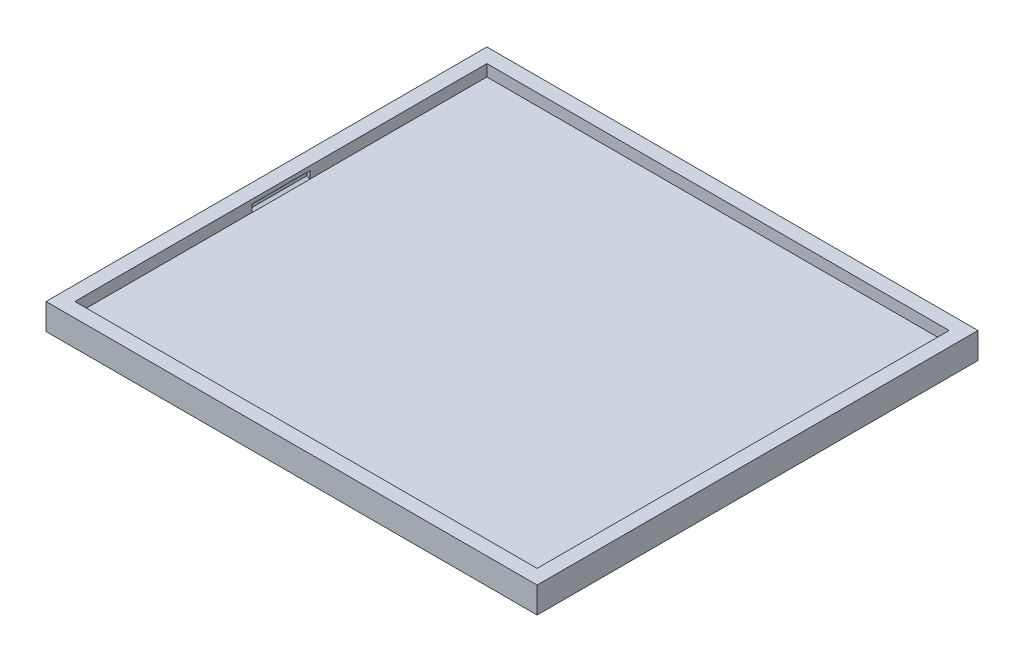
ISO-10303-21;
HEADER;
FILE_DESCRIPTION(('STEP AP214'),'2;1');
FILE_NAME('part.step','',(''),(''),'','','');
FILE_SCHEMA(('AUTOMOTIVE_DESIGN { 1 0 10303 214 1 1 1 1 }'));
ENDSEC;
DATA;
#1=APPLICATION_CONTEXT('core data for automotive mechanical design processes');
#2=APPLICATION_PROTOCOL_DEFINITION('international standard','automotive_design',2000,#1);
#3=PRODUCT_CONTEXT('',#1,'mechanical');
#4=PRODUCT('Part','Part','',(#3));
#5=PRODUCT_RELATED_PRODUCT_CATEGORY('part','',(#4));
#6=PRODUCT_DEFINITION_FORMATION('','',#4);
#7=PRODUCT_DEFINITION_CONTEXT('part definition',#1,'design');
#8=PRODUCT_DEFINITION('design','',#6,#7);
#9=PRODUCT_DEFINITION_SHAPE('','',#8);
#10=(LENGTH_UNIT() NAMED_UNIT(*) SI_UNIT(.MILLI.,.METRE.));
#11=(NAMED_UNIT(*) PLANE_ANGLE_UNIT() SI_UNIT($,.RADIAN.));
#12=(NAMED_UNIT(*) SI_UNIT($,.STERADIAN.) SOLID_ANGLE_UNIT());
#13=UNCERTAINTY_MEASURE_WITH_UNIT(LENGTH_MEASURE(1.E-05),#10,'distance_accuracy_value','');
#14=(GEOMETRIC_REPRESENTATION_CONTEXT(3) GLOBAL_UNCERTAINTY_ASSIGNED_CONTEXT((#13)) GLOBAL_UNIT_ASSIGNED_CONTEXT((#10,
#11,#12)) REPRESENTATION_CONTEXT('',''));
#15=CARTESIAN_POINT('',(0.,0.,0.));
#16=DIRECTION('',(0.,0.,1.));
#17=DIRECTION('',(1.,0.,0.));
#18=AXIS2_PLACEMENT_3D('',#15,#16,#17);
#19=CARTESIAN_POINT('',(-0.05,12.7,0.05));
#20=DIRECTION('',(1.,0.,0.));
#21=DIRECTION('',(0.,0.,-1.));
#22=AXIS2_PLACEMENT_3D('',#19,#20,#21);
#23=PLANE('',#22);
#24=DIRECTION('',(0.,0.,1.));
#25=VECTOR('',#24,1.);
#26=CARTESIAN_POINT('',(-0.05,9.5957106781186,0.0499999999999992));
#27=LINE('',#26,#25);
#28=CARTESIAN_POINT('',(-0.05,9.59571067811863,-103.251));
#29=VERTEX_POINT('',#28);
#30=CARTESIAN_POINT('',(-0.05,9.59571067811862,-77.851));
#31=VERTEX_POINT('',#30);
#32=EDGE_CURVE('E11',#29,#31,#27,.T.);
#33=ORIENTED_EDGE('',*,*,#32,.F.);
#34=DIRECTION('',(0.,-1.,0.));
#35=VECTOR('',#34,1.);
#36=CARTESIAN_POINT('',(-0.05,12.7,-103.251));
#37=LINE('',#36,#35);
#38=CARTESIAN_POINT('',(-0.05,6.35,-103.251));
#39=VERTEX_POINT('',#38);
#40=EDGE_CURVE('E245',#29,#39,#37,.T.);
#41=ORIENTED_EDGE('',*,*,#40,.T.);
#42=DIRECTION('',(0.,0.,-1.));
#43=VECTOR('',#42,1.);
#44=CARTESIAN_POINT('',(-0.05,6.35,0.));
#45=LINE('',#44,#43);
#46=CARTESIAN_POINT('',(-0.05,6.35,-181.152));
#47=VERTEX_POINT('',#46);
#48=EDGE_CURVE('E320',#39,#47,#45,.T.);
#49=ORIENTED_EDGE('',*,*,#48,.T.);
#50=DIRECTION('',(0.,-1.,0.));
#51=VECTOR('',#50,1.);
#52=CARTESIAN_POINT('',(-0.05,12.7,-181.152));
#53=LINE('',#52,#51);
#54=CARTESIAN_POINT('',(-0.05,11.43,-181.152));
#55=VERTEX_POINT('',#54);
#56=EDGE_CURVE('E331',#55,#47,#53,.T.);
#57=ORIENTED_EDGE('',*,*,#56,.F.);
#58=DIRECTION('',(0.,0.,1.));
#59=VECTOR('',#58,1.);
#60=CARTESIAN_POINT('',(-0.05,11.43,-181.152));
#61=LINE('',#60,#59);
#62=CARTESIAN_POINT('',(-0.05,11.43,0.05));
#63=VERTEX_POINT('',#62);
#64=EDGE_CURVE('E249',#55,#63,#61,.T.);
#65=ORIENTED_EDGE('',*,*,#64,.T.);
#66=DIRECTION('',(0.,-1.,0.));
#67=VECTOR('',#66,1.);
#68=CARTESIAN_POINT('',(-0.05,12.7,0.05));
#69=LINE('',#68,#67);
#70=CARTESIAN_POINT('',(-0.05,6.35,0.05));
#71=VERTEX_POINT('',#70);
#72=EDGE_CURVE('E343',#63,#71,#69,.T.);
#73=ORIENTED_EDGE('',*,*,#72,.T.);
#74=CARTESIAN_POINT('',(-0.05,6.35,-77.851));
#75=VERTEX_POINT('',#74);
#76=EDGE_CURVE('E319',#71,#75,#45,.T.);
#77=ORIENTED_EDGE('',*,*,#76,.T.);
#78=DIRECTION('',(0.,-1.,0.));
#79=VECTOR('',#78,1.);
#80=CARTESIAN_POINT('',(-0.05,12.7,-77.851));
#81=LINE('',#80,#79);
#82=EDGE_CURVE('E66',#31,#75,#81,.T.);
#83=ORIENTED_EDGE('',*,*,#82,.F.);
#84=EDGE_LOOP('',(#33,#41,#49,#57,#65,#73,#77,#83));
#85=FACE_BOUND('',#84,.T.);
#86=ADVANCED_FACE('F55',(#85),#23,.T.);
#87=CARTESIAN_POINT('',(0.,6.35,0.));
#88=DIRECTION('',(0.,1.,0.));
#89=DIRECTION('',(0.,0.,1.));
#90=AXIS2_PLACEMENT_3D('',#87,#88,#89);
#91=PLANE('',#90);
#92=ORIENTED_EDGE('',*,*,#48,.F.);
#93=DIRECTION('',(1.,0.,0.));
#94=VECTOR('',#93,1.);
#95=CARTESIAN_POINT('',(0.,6.35,-103.251));
#96=LINE('',#95,#94);
#97=CARTESIAN_POINT('',(0.,6.35,-103.251));
#98=VERTEX_POINT('',#97);
#99=EDGE_CURVE('E62',#39,#98,#96,.T.);
#100=ORIENTED_EDGE('',*,*,#99,.T.);
#101=DIRECTION('',(0.,0.,-1.));
#102=VECTOR('',#101,1.);
#103=CARTESIAN_POINT('',(0.,6.35,0.));
#104=LINE('',#103,#102);
#105=CARTESIAN_POINT('',(0.,6.35,-77.851));
#106=VERTEX_POINT('',#105);
#107=EDGE_CURVE('E391',#106,#98,#104,.T.);
#108=ORIENTED_EDGE('',*,*,#107,.F.);
#109=DIRECTION('',(1.,0.,0.));
#110=VECTOR('',#109,1.);
#111=CARTESIAN_POINT('',(0.,6.35,-77.851));
#112=LINE('',#111,#110);
#113=EDGE_CURVE('E215',#75,#106,#112,.T.);
#114=ORIENTED_EDGE('',*,*,#113,.F.);
#115=ORIENTED_EDGE('',*,*,#76,.F.);
#116=DIRECTION('',(1.,0.,0.));
#117=VECTOR('',#116,1.);
#118=CARTESIAN_POINT('',(0.,6.35,0.05));
#119=LINE('',#118,#117);
#120=CARTESIAN_POINT('',(203.25,6.35,0.05));
#121=VERTEX_POINT('',#120);
#122=EDGE_CURVE('E324',#71,#121,#119,.T.);
#123=ORIENTED_EDGE('',*,*,#122,.T.);
#124=DIRECTION('',(0.,0.,-1.));
#125=VECTOR('',#124,1.);
#126=CARTESIAN_POINT('',(203.25,6.35,0.));
#127=LINE('',#126,#125);
#128=CARTESIAN_POINT('',(203.25,6.35,-77.851));
#129=VERTEX_POINT('',#128);
#130=EDGE_CURVE('E330',#121,#129,#127,.T.);
#131=ORIENTED_EDGE('',*,*,#130,.T.);
#132=DIRECTION('',(1.,0.,0.));
#133=VECTOR('',#132,1.);
#134=CARTESIAN_POINT('',(0.,6.35,-77.851));
#135=LINE('',#134,#133);
#136=CARTESIAN_POINT('',(203.2,6.35,-77.851));
#137=VERTEX_POINT('',#136);
#138=EDGE_CURVE('E376',#137,#129,#135,.T.);
#139=ORIENTED_EDGE('',*,*,#138,.F.);
#140=DIRECTION('',(0.,0.,-1.));
#141=VECTOR('',#140,1.);
#142=CARTESIAN_POINT('',(203.2,6.35,0.));
#143=LINE('',#142,#141);
#144=CARTESIAN_POINT('',(203.2,6.35,-103.251));
#145=VERTEX_POINT('',#144);
#146=EDGE_CURVE('E378',#137,#145,#143,.T.);
#147=ORIENTED_EDGE('',*,*,#146,.T.);
#148=DIRECTION('',(1.,0.,0.));
#149=VECTOR('',#148,1.);
#150=CARTESIAN_POINT('',(0.,6.35,-103.251));
#151=LINE('',#150,#149);
#152=CARTESIAN_POINT('',(203.25,6.35,-103.251));
#153=VERTEX_POINT('',#152);
#154=EDGE_CURVE('E384',#145,#153,#151,.T.);
#155=ORIENTED_EDGE('',*,*,#154,.T.);
#156=CARTESIAN_POINT('',(203.25,6.35,-181.152));
#157=VERTEX_POINT('',#156);
#158=EDGE_CURVE('E328',#153,#157,#127,.T.);
#159=ORIENTED_EDGE('',*,*,#158,.T.);
#160=DIRECTION('',(1.,0.,0.));
#161=VECTOR('',#160,1.);
#162=CARTESIAN_POINT('',(0.,6.35,-181.152));
#163=LINE('',#162,#161);
#164=EDGE_CURVE('E333',#47,#157,#163,.T.);
#165=ORIENTED_EDGE('',*,*,#164,.F.);
#166=EDGE_LOOP('',(#92,#100,#108,#114,#115,#123,#131,#139,#147,#155,#159,#165));
#167=FACE_BOUND('',#166,.T.);
#168=ADVANCED_FACE('F400',(#167),#91,.T.);
#169=CARTESIAN_POINT('',(203.25,12.7,0.05));
#170=DIRECTION('',(-1.,0.,0.));
#171=DIRECTION('',(0.,0.,1.));
#172=AXIS2_PLACEMENT_3D('',#169,#170,#171);
#173=PLANE('',#172);
#174=DIRECTION('',(0.,-1.,0.));
#175=VECTOR('',#174,1.);
#176=CARTESIAN_POINT('',(203.25,12.7,0.05));
#177=LINE('',#176,#175);
#178=CARTESIAN_POINT('',(203.25,11.43,0.05));
#179=VERTEX_POINT('',#178);
#180=EDGE_CURVE('E344',#179,#121,#177,.T.);
#181=ORIENTED_EDGE('',*,*,#180,.F.);
#182=DIRECTION('',(0.,0.,-1.));
#183=VECTOR('',#182,1.);
#184=CARTESIAN_POINT('',(203.25,11.43,0.05));
#185=LINE('',#184,#183);
#186=CARTESIAN_POINT('',(203.25,11.43,-181.152));
#187=VERTEX_POINT('',#186);
#188=EDGE_CURVE('E260',#179,#187,#185,.T.);
#189=ORIENTED_EDGE('',*,*,#188,.T.);
#190=DIRECTION('',(0.,-1.,0.));
#191=VECTOR('',#190,1.);
#192=CARTESIAN_POINT('',(203.25,12.7,-181.152));
#193=LINE('',#192,#191);
#194=EDGE_CURVE('E339',#187,#157,#193,.T.);
#195=ORIENTED_EDGE('',*,*,#194,.T.);
#196=ORIENTED_EDGE('',*,*,#158,.F.);
#197=DIRECTION('',(0.,1.,0.));
#198=VECTOR('',#197,1.);
#199=CARTESIAN_POINT('',(203.25,12.7,-103.251));
#200=LINE('',#199,#198);
#201=CARTESIAN_POINT('',(203.25,9.59571067811865,-103.251));
#202=VERTEX_POINT('',#201);
#203=EDGE_CURVE('E312',#153,#202,#200,.T.);
#204=ORIENTED_EDGE('',*,*,#203,.T.);
#205=DIRECTION('',(0.,0.,1.));
#206=VECTOR('',#205,1.);
#207=CARTESIAN_POINT('',(203.25,9.59571067811865,0.05));
#208=LINE('',#207,#206);
#209=CARTESIAN_POINT('',(203.25,9.59571067811865,-77.851));
#210=VERTEX_POINT('',#209);
#211=EDGE_CURVE('E389',#202,#210,#208,.T.);
#212=ORIENTED_EDGE('',*,*,#211,.T.);
#213=DIRECTION('',(0.,1.,0.));
#214=VECTOR('',#213,1.);
#215=CARTESIAN_POINT('',(203.25,12.7,-77.851));
#216=LINE('',#215,#214);
#217=EDGE_CURVE('E309',#129,#210,#216,.T.);
#218=ORIENTED_EDGE('',*,*,#217,.F.);
#219=ORIENTED_EDGE('',*,*,#130,.F.);
#220=EDGE_LOOP('',(#181,#189,#195,#196,#204,#212,#218,#219));
#221=FACE_BOUND('',#220,.T.);
#222=ADVANCED_FACE('F430',(#221),#173,.T.);
#223=CARTESIAN_POINT('',(-0.05,12.7,-181.152));
#224=DIRECTION('',(0.,0.,1.));
#225=DIRECTION('',(1.,0.,0.));
#226=AXIS2_PLACEMENT_3D('',#223,#224,#225);
#227=PLANE('',#226);
#228=ORIENTED_EDGE('',*,*,#194,.F.);
#229=DIRECTION('',(-1.,0.,0.));
#230=VECTOR('',#229,1.);
#231=CARTESIAN_POINT('',(203.25,11.43,-181.152));
#232=LINE('',#231,#230);
#233=EDGE_CURVE('E246',#187,#55,#232,.T.);
#234=ORIENTED_EDGE('',*,*,#233,.T.);
#235=ORIENTED_EDGE('',*,*,#56,.T.);
#236=ORIENTED_EDGE('',*,*,#164,.T.);
#237=EDGE_LOOP('',(#228,#234,#235,#236));
#238=FACE_BOUND('',#237,.T.);
#239=ADVANCED_FACE('F494',(#238),#227,.T.);
#240=CARTESIAN_POINT('',(-0.05,12.7,0.05));
#241=DIRECTION('',(0.,0.,-1.));
#242=DIRECTION('',(-1.,0.,0.));
#243=AXIS2_PLACEMENT_3D('',#240,#241,#242);
#244=PLANE('',#243);
#245=ORIENTED_EDGE('',*,*,#72,.F.);
#246=DIRECTION('',(1.,0.,0.));
#247=VECTOR('',#246,1.);
#248=CARTESIAN_POINT('',(-0.05,11.43,0.05));
#249=LINE('',#248,#247);
#250=EDGE_CURVE('E251',#63,#179,#249,.T.);
#251=ORIENTED_EDGE('',*,*,#250,.T.);
#252=ORIENTED_EDGE('',*,*,#180,.T.);
#253=ORIENTED_EDGE('',*,*,#122,.F.);
#254=EDGE_LOOP('',(#245,#251,#252,#253));
#255=FACE_BOUND('',#254,.T.);
#256=ADVANCED_FACE('F431',(#255),#244,.T.);
#257=CARTESIAN_POINT('',(203.2,6.26339745962156,-103.251));
#258=DIRECTION('',(1.,0.,0.));
#259=DIRECTION('',(0.,0.,-1.));
#260=AXIS2_PLACEMENT_3D('',#257,#258,#259);
#261=PLANE('',#260);
#262=DIRECTION('',(0.,1.,0.));
#263=VECTOR('',#262,1.);
#264=CARTESIAN_POINT('',(203.2,6.26339745962156,-77.851));
#265=LINE('',#264,#263);
#266=CARTESIAN_POINT('',(203.2,6.26339745962156,-77.851));
#267=VERTEX_POINT('',#266);
#268=EDGE_CURVE('E275',#267,#137,#265,.T.);
#269=ORIENTED_EDGE('',*,*,#268,.F.);
#270=DIRECTION('',(0.,0.,1.));
#271=VECTOR('',#270,1.);
#272=CARTESIAN_POINT('',(203.2,6.26339745962156,-103.251));
#273=LINE('',#272,#271);
#274=CARTESIAN_POINT('',(203.2,6.26339745962156,-103.251));
#275=VERTEX_POINT('',#274);
#276=EDGE_CURVE('E297',#275,#267,#273,.T.);
#277=ORIENTED_EDGE('',*,*,#276,.F.);
#278=DIRECTION('',(0.,1.,0.));
#279=VECTOR('',#278,1.);
#280=CARTESIAN_POINT('',(203.2,6.26339745962156,-103.251));
#281=LINE('',#280,#279);
#282=EDGE_CURVE('E288',#275,#145,#281,.T.);
#283=ORIENTED_EDGE('',*,*,#282,.T.);
#284=ORIENTED_EDGE('',*,*,#146,.F.);
#285=EDGE_LOOP('',(#269,#277,#283,#284));
#286=FACE_BOUND('',#285,.T.);
#287=ADVANCED_FACE('F490',(#286),#261,.T.);
#288=CARTESIAN_POINT('',(203.2,9.64571067811865,-103.251));
#289=DIRECTION('',(-0.707106781186544,-0.707106781186551,0.));
#290=DIRECTION('',(0.707106781186551,-0.707106781186544,0.));
#291=AXIS2_PLACEMENT_3D('',#288,#289,#290);
#292=PLANE('',#291);
#293=DIRECTION('',(0.707106781186551,-0.707106781186544,0.));
#294=VECTOR('',#293,1.);
#295=CARTESIAN_POINT('',(203.2,9.64571067811865,-103.251));
#296=LINE('',#295,#294);
#297=CARTESIAN_POINT('',(204.507721605791,8.33798907232798,-103.251));
#298=VERTEX_POINT('',#297);
#299=EDGE_CURVE('E286',#202,#298,#296,.T.);
#300=ORIENTED_EDGE('',*,*,#299,.T.);
#301=DIRECTION('',(0.,0.,1.));
#302=VECTOR('',#301,1.);
#303=CARTESIAN_POINT('',(204.507721605791,8.33798907232798,-103.251));
#304=LINE('',#303,#302);
#305=CARTESIAN_POINT('',(204.507721605791,8.33798907232798,-77.851));
#306=VERTEX_POINT('',#305);
#307=EDGE_CURVE('E306',#298,#306,#304,.T.);
#308=ORIENTED_EDGE('',*,*,#307,.T.);
#309=DIRECTION('',(0.707106781186551,-0.707106781186544,0.));
#310=VECTOR('',#309,1.);
#311=CARTESIAN_POINT('',(203.2,9.64571067811865,-77.851));
#312=LINE('',#311,#310);
#313=EDGE_CURVE('E273',#210,#306,#312,.T.);
#314=ORIENTED_EDGE('',*,*,#313,.F.);
#315=ORIENTED_EDGE('',*,*,#211,.F.);
#316=EDGE_LOOP('',(#300,#308,#314,#315));
#317=FACE_BOUND('',#316,.T.);
#318=ADVANCED_FACE('F481',(#317),#292,.T.);
#319=CARTESIAN_POINT('',(204.507721605791,7.0184108807499,-103.251));
#320=DIRECTION('',(1.,0.,0.));
#321=DIRECTION('',(0.,0.,-1.));
#322=AXIS2_PLACEMENT_3D('',#319,#320,#321);
#323=PLANE('',#322);
#324=ORIENTED_EDGE('',*,*,#307,.F.);
#325=DIRECTION('',(0.,1.,0.));
#326=VECTOR('',#325,1.);
#327=CARTESIAN_POINT('',(204.507721605791,7.0184108807499,-103.251));
#328=LINE('',#327,#326);
#329=CARTESIAN_POINT('',(204.507721605791,7.0184108807499,-103.251));
#330=VERTEX_POINT('',#329);
#331=EDGE_CURVE('E291',#330,#298,#328,.T.);
#332=ORIENTED_EDGE('',*,*,#331,.F.);
#333=DIRECTION('',(0.,0.,1.));
#334=VECTOR('',#333,1.);
#335=CARTESIAN_POINT('',(204.507721605791,7.0184108807499,-103.251));
#336=LINE('',#335,#334);
#337=CARTESIAN_POINT('',(204.507721605791,7.0184108807499,-77.851));
#338=VERTEX_POINT('',#337);
#339=EDGE_CURVE('E303',#330,#338,#336,.T.);
#340=ORIENTED_EDGE('',*,*,#339,.T.);
#341=DIRECTION('',(0.,1.,0.));
#342=VECTOR('',#341,1.);
#343=CARTESIAN_POINT('',(204.507721605791,7.0184108807499,-77.851));
#344=LINE('',#343,#342);
#345=EDGE_CURVE('E280',#338,#306,#344,.T.);
#346=ORIENTED_EDGE('',*,*,#345,.T.);
#347=EDGE_LOOP('',(#324,#332,#340,#346));
#348=FACE_BOUND('',#347,.T.);
#349=ADVANCED_FACE('F483',(#348),#323,.F.);
#350=CARTESIAN_POINT('',(204.507721605791,7.0184108807499,-103.251));
#351=DIRECTION('',(-0.500000000000001,0.866025403784438,0.));
#352=DIRECTION('',(-0.866025403784438,-0.500000000000001,0.));
#353=AXIS2_PLACEMENT_3D('',#350,#351,#352);
#354=PLANE('',#353);
#355=ORIENTED_EDGE('',*,*,#339,.F.);
#356=DIRECTION('',(-0.866025403784438,-0.500000000000001,0.));
#357=VECTOR('',#356,1.);
#358=CARTESIAN_POINT('',(204.507721605791,7.0184108807499,-103.251));
#359=LINE('',#358,#357);
#360=EDGE_CURVE('E300',#330,#275,#359,.T.);
#361=ORIENTED_EDGE('',*,*,#360,.T.);
#362=ORIENTED_EDGE('',*,*,#276,.T.);
#363=DIRECTION('',(-0.866025403784438,-0.500000000000001,0.));
#364=VECTOR('',#363,1.);
#365=CARTESIAN_POINT('',(204.507721605791,7.0184108807499,-77.851));
#366=LINE('',#365,#364);
#367=EDGE_CURVE('E285',#338,#267,#366,.T.);
#368=ORIENTED_EDGE('',*,*,#367,.F.);
#369=EDGE_LOOP('',(#355,#361,#362,#368));
#370=FACE_BOUND('',#369,.T.);
#371=ADVANCED_FACE('F480',(#370),#354,.T.);
#372=CARTESIAN_POINT('',(0.,0.,-103.251));
#373=DIRECTION('',(0.,0.,1.));
#374=DIRECTION('',(1.,0.,0.));
#375=AXIS2_PLACEMENT_3D('',#372,#373,#374);
#376=PLANE('',#375);
#377=ORIENTED_EDGE('',*,*,#154,.F.);
#378=ORIENTED_EDGE('',*,*,#282,.F.);
#379=ORIENTED_EDGE('',*,*,#360,.F.);
#380=ORIENTED_EDGE('',*,*,#331,.T.);
#381=ORIENTED_EDGE('',*,*,#299,.F.);
#382=ORIENTED_EDGE('',*,*,#203,.F.);
#383=EDGE_LOOP('',(#377,#378,#379,#380,#381,#382));
#384=FACE_BOUND('',#383,.T.);
#385=ADVANCED_FACE('F468',(#384),#376,.T.);
#386=CARTESIAN_POINT('',(0.,0.,-77.851));
#387=DIRECTION('',(0.,0.,1.));
#388=DIRECTION('',(1.,0.,0.));
#389=AXIS2_PLACEMENT_3D('',#386,#387,#388);
#390=PLANE('',#389);
#391=ORIENTED_EDGE('',*,*,#217,.T.);
#392=ORIENTED_EDGE('',*,*,#313,.T.);
#393=ORIENTED_EDGE('',*,*,#345,.F.);
#394=ORIENTED_EDGE('',*,*,#367,.T.);
#395=ORIENTED_EDGE('',*,*,#268,.T.);
#396=ORIENTED_EDGE('',*,*,#138,.T.);
#397=EDGE_LOOP('',(#391,#392,#393,#394,#395,#396));
#398=FACE_BOUND('',#397,.T.);
#399=ADVANCED_FACE('F464',(#398),#390,.F.);
#400=CARTESIAN_POINT('',(0.,11.43,0.));
#401=DIRECTION('',(0.,1.,0.));
#402=DIRECTION('',(0.,0.,1.));
#403=AXIS2_PLACEMENT_3D('',#400,#401,#402);
#404=PLANE('',#403);
#405=ORIENTED_EDGE('',*,*,#188,.F.);
#406=ORIENTED_EDGE('',*,*,#250,.F.);
#407=ORIENTED_EDGE('',*,*,#64,.F.);
#408=ORIENTED_EDGE('',*,*,#233,.F.);
#409=EDGE_LOOP('',(#405,#406,#407,#408));
#410=FACE_BOUND('',#409,.T.);
#411=DIRECTION('',(-1.,0.,0.));
#412=VECTOR('',#411,1.);
#413=CARTESIAN_POINT('',(209.6,11.43,-187.502));
#414=LINE('',#413,#412);
#415=CARTESIAN_POINT('',(209.6,11.43,-187.502));
#416=VERTEX_POINT('',#415);
#417=CARTESIAN_POINT('',(-6.4,11.43,-187.502));
#418=VERTEX_POINT('',#417);
#419=EDGE_CURVE('E263',#416,#418,#414,.T.);
#420=ORIENTED_EDGE('',*,*,#419,.T.);
#421=DIRECTION('',(0.,0.,1.));
#422=VECTOR('',#421,1.);
#423=CARTESIAN_POINT('',(-6.4,11.43,-187.502));
#424=LINE('',#423,#422);
#425=CARTESIAN_POINT('',(-6.39999999999998,11.43,6.4));
#426=VERTEX_POINT('',#425);
#427=EDGE_CURVE('E262',#418,#426,#424,.T.);
#428=ORIENTED_EDGE('',*,*,#427,.T.);
#429=DIRECTION('',(1.,0.,0.));
#430=VECTOR('',#429,1.);
#431=CARTESIAN_POINT('',(-6.39999999999998,11.43,6.4));
#432=LINE('',#431,#430);
#433=CARTESIAN_POINT('',(209.6,11.43,6.4));
#434=VERTEX_POINT('',#433);
#435=EDGE_CURVE('E269',#426,#434,#432,.T.);
#436=ORIENTED_EDGE('',*,*,#435,.T.);
#437=DIRECTION('',(0.,0.,-1.));
#438=VECTOR('',#437,1.);
#439=CARTESIAN_POINT('',(209.6,11.43,6.4));
#440=LINE('',#439,#438);
#441=EDGE_CURVE('E77',#434,#416,#440,.T.);
#442=ORIENTED_EDGE('',*,*,#441,.T.);
#443=EDGE_LOOP('',(#420,#428,#436,#442));
#444=FACE_BOUND('',#443,.T.);
#445=ADVANCED_FACE('F440',(#410,#444),#404,.T.);
#446=CARTESIAN_POINT('',(0.,0.,0.));
#447=DIRECTION('',(0.,1.,0.));
#448=DIRECTION('',(0.,0.,1.));
#449=AXIS2_PLACEMENT_3D('',#446,#447,#448);
#450=PLANE('',#449);
#451=DIRECTION('',(0.,0.,1.));
#452=VECTOR('',#451,1.);
#453=CARTESIAN_POINT('',(-6.4,0.,-187.502));
#454=LINE('',#453,#452);
#455=CARTESIAN_POINT('',(-6.4,0.,-187.502));
#456=VERTEX_POINT('',#455);
#457=CARTESIAN_POINT('',(-6.39999999999998,0.,6.4));
#458=VERTEX_POINT('',#457);
#459=EDGE_CURVE('E346',#456,#458,#454,.T.);
#460=ORIENTED_EDGE('',*,*,#459,.F.);
#461=DIRECTION('',(-1.,0.,0.));
#462=VECTOR('',#461,1.);
#463=CARTESIAN_POINT('',(-6.4,0.,-187.502));
#464=LINE('',#463,#462);
#465=CARTESIAN_POINT('',(209.6,0.,-187.502));
#466=VERTEX_POINT('',#465);
#467=EDGE_CURVE('E359',#466,#456,#464,.T.);
#468=ORIENTED_EDGE('',*,*,#467,.F.);
#469=DIRECTION('',(0.,0.,-1.));
#470=VECTOR('',#469,1.);
#471=CARTESIAN_POINT('',(209.6,0.,-187.502));
#472=LINE('',#471,#470);
#473=CARTESIAN_POINT('',(209.6,0.,6.4));
#474=VERTEX_POINT('',#473);
#475=EDGE_CURVE('E358',#474,#466,#472,.T.);
#476=ORIENTED_EDGE('',*,*,#475,.F.);
#477=DIRECTION('',(1.,0.,0.));
#478=VECTOR('',#477,1.);
#479=CARTESIAN_POINT('',(-6.39999999999998,0.,6.4));
#480=LINE('',#479,#478);
#481=EDGE_CURVE('E354',#458,#474,#480,.T.);
#482=ORIENTED_EDGE('',*,*,#481,.F.);
#483=EDGE_LOOP('',(#460,#468,#476,#482));
#484=FACE_BOUND('',#483,.T.);
#485=ADVANCED_FACE('F433',(#484),#450,.F.);
#486=CARTESIAN_POINT('',(-6.4,12.7,-187.502));
#487=DIRECTION('',(0.,0.,1.));
#488=DIRECTION('',(1.,0.,0.));
#489=AXIS2_PLACEMENT_3D('',#486,#487,#488);
#490=PLANE('',#489);
#491=ORIENTED_EDGE('',*,*,#419,.F.);
#492=DIRECTION('',(0.,-1.,0.));
#493=VECTOR('',#492,1.);
#494=CARTESIAN_POINT('',(209.6,12.7,-187.502));
#495=LINE('',#494,#493);
#496=EDGE_CURVE('E370',#416,#466,#495,.T.);
#497=ORIENTED_EDGE('',*,*,#496,.T.);
#498=ORIENTED_EDGE('',*,*,#467,.T.);
#499=DIRECTION('',(0.,-1.,0.));
#500=VECTOR('',#499,1.);
#501=CARTESIAN_POINT('',(-6.4,12.7,-187.502));
#502=LINE('',#501,#500);
#503=EDGE_CURVE('E364',#418,#456,#502,.T.);
#504=ORIENTED_EDGE('',*,*,#503,.F.);
#505=EDGE_LOOP('',(#491,#497,#498,#504));
#506=FACE_BOUND('',#505,.T.);
#507=ADVANCED_FACE('F436',(#506),#490,.F.);
#508=CARTESIAN_POINT('',(209.6,12.7,-187.502));
#509=DIRECTION('',(-1.,0.,0.));
#510=DIRECTION('',(0.,0.,1.));
#511=AXIS2_PLACEMENT_3D('',#508,#509,#510);
#512=PLANE('',#511);
#513=ORIENTED_EDGE('',*,*,#441,.F.);
#514=DIRECTION('',(0.,-1.,0.));
#515=VECTOR('',#514,1.);
#516=CARTESIAN_POINT('',(209.6,12.7,6.4));
#517=LINE('',#516,#515);
#518=EDGE_CURVE('E369',#434,#474,#517,.T.);
#519=ORIENTED_EDGE('',*,*,#518,.T.);
#520=ORIENTED_EDGE('',*,*,#475,.T.);
#521=ORIENTED_EDGE('',*,*,#496,.F.);
#522=EDGE_LOOP('',(#513,#519,#520,#521));
#523=FACE_BOUND('',#522,.T.);
#524=ADVANCED_FACE('F441',(#523),#512,.F.);
#525=CARTESIAN_POINT('',(-6.39999999999998,12.7,6.4));
#526=DIRECTION('',(0.,0.,-1.));
#527=DIRECTION('',(-1.,0.,0.));
#528=AXIS2_PLACEMENT_3D('',#525,#526,#527);
#529=PLANE('',#528);
#530=ORIENTED_EDGE('',*,*,#435,.F.);
#531=DIRECTION('',(0.,-1.,0.));
#532=VECTOR('',#531,1.);
#533=CARTESIAN_POINT('',(-6.39999999999998,12.7,6.4));
#534=LINE('',#533,#532);
#535=EDGE_CURVE('E373',#426,#458,#534,.T.);
#536=ORIENTED_EDGE('',*,*,#535,.T.);
#537=ORIENTED_EDGE('',*,*,#481,.T.);
#538=ORIENTED_EDGE('',*,*,#518,.F.);
#539=EDGE_LOOP('',(#530,#536,#537,#538));
#540=FACE_BOUND('',#539,.T.);
#541=ADVANCED_FACE('F443',(#540),#529,.F.);
#542=CARTESIAN_POINT('',(-6.4,12.7,-187.502));
#543=DIRECTION('',(1.,0.,0.));
#544=DIRECTION('',(0.,0.,-1.));
#545=AXIS2_PLACEMENT_3D('',#542,#543,#544);
#546=PLANE('',#545);
#547=ORIENTED_EDGE('',*,*,#427,.F.);
#548=ORIENTED_EDGE('',*,*,#503,.T.);
#549=ORIENTED_EDGE('',*,*,#459,.T.);
#550=ORIENTED_EDGE('',*,*,#535,.F.);
#551=EDGE_LOOP('',(#547,#548,#549,#550));
#552=FACE_BOUND('',#551,.T.);
#553=ADVANCED_FACE('F53',(#552),#546,.F.);
#554=CARTESIAN_POINT('',(0.,6.26339745962156,-103.251));
#555=DIRECTION('',(1.,0.,0.));
#556=DIRECTION('',(0.,0.,-1.));
#557=AXIS2_PLACEMENT_3D('',#554,#555,#556);
#558=PLANE('',#557);
#559=ORIENTED_EDGE('',*,*,#107,.T.);
#560=DIRECTION('',(0.,1.,0.));
#561=VECTOR('',#560,1.);
#562=CARTESIAN_POINT('',(0.,6.26339745962156,-103.251));
#563=LINE('',#562,#561);
#564=CARTESIAN_POINT('',(0.,6.26339745962156,-103.251));
#565=VERTEX_POINT('',#564);
#566=EDGE_CURVE('E200',#565,#98,#563,.T.);
#567=ORIENTED_EDGE('',*,*,#566,.F.);
#568=DIRECTION('',(0.,0.,1.));
#569=VECTOR('',#568,1.);
#570=CARTESIAN_POINT('',(0.,6.26339745962156,-103.251));
#571=LINE('',#570,#569);
#572=CARTESIAN_POINT('',(0.,6.26339745962156,-77.851));
#573=VERTEX_POINT('',#572);
#574=EDGE_CURVE('E188',#565,#573,#571,.T.);
#575=ORIENTED_EDGE('',*,*,#574,.T.);
#576=DIRECTION('',(0.,1.,0.));
#577=VECTOR('',#576,1.);
#578=CARTESIAN_POINT('',(0.,6.26339745962156,-77.851));
#579=LINE('',#578,#577);
#580=EDGE_CURVE('E191',#573,#106,#579,.T.);
#581=ORIENTED_EDGE('',*,*,#580,.T.);
#582=EDGE_LOOP('',(#559,#567,#575,#581));
#583=FACE_BOUND('',#582,.T.);
#584=ADVANCED_FACE('F194',(#583),#558,.F.);
#585=CARTESIAN_POINT('',(-1.30772160579065,7.0184108807499,-103.251));
#586=DIRECTION('',(-0.500000000000001,-0.866025403784438,0.));
#587=DIRECTION('',(0.866025403784438,-0.500000000000001,0.));
#588=AXIS2_PLACEMENT_3D('',#585,#586,#587);
#589=PLANE('',#588);
#590=ORIENTED_EDGE('',*,*,#574,.F.);
#591=DIRECTION('',(0.866025403784438,-0.500000000000001,0.));
#592=VECTOR('',#591,1.);
#593=CARTESIAN_POINT('',(-1.30772160579065,7.0184108807499,-103.251));
#594=LINE('',#593,#592);
#595=CARTESIAN_POINT('',(-1.30772160579065,7.0184108807499,-103.251));
#596=VERTEX_POINT('',#595);
#597=EDGE_CURVE('E225',#596,#565,#594,.T.);
#598=ORIENTED_EDGE('',*,*,#597,.F.);
#599=DIRECTION('',(0.,0.,1.));
#600=VECTOR('',#599,1.);
#601=CARTESIAN_POINT('',(-1.30772160579065,7.0184108807499,-103.251));
#602=LINE('',#601,#600);
#603=CARTESIAN_POINT('',(-1.30772160579065,7.0184108807499,-77.851));
#604=VERTEX_POINT('',#603);
#605=EDGE_CURVE('E204',#596,#604,#602,.T.);
#606=ORIENTED_EDGE('',*,*,#605,.T.);
#607=DIRECTION('',(0.866025403784438,-0.500000000000001,0.));
#608=VECTOR('',#607,1.);
#609=CARTESIAN_POINT('',(-1.30772160579065,7.0184108807499,-77.851));
#610=LINE('',#609,#608);
#611=EDGE_CURVE('E201',#604,#573,#610,.T.);
#612=ORIENTED_EDGE('',*,*,#611,.T.);
#613=EDGE_LOOP('',(#590,#598,#606,#612));
#614=FACE_BOUND('',#613,.T.);
#615=ADVANCED_FACE('F207',(#614),#589,.F.);
#616=CARTESIAN_POINT('',(-1.30772160579065,7.0184108807499,-103.251));
#617=DIRECTION('',(1.,0.,0.));
#618=DIRECTION('',(0.,0.,-1.));
#619=AXIS2_PLACEMENT_3D('',#616,#617,#618);
#620=PLANE('',#619);
#621=ORIENTED_EDGE('',*,*,#605,.F.);
#622=DIRECTION('',(0.,1.,0.));
#623=VECTOR('',#622,1.);
#624=CARTESIAN_POINT('',(-1.30772160579065,7.0184108807499,-103.251));
#625=LINE('',#624,#623);
#626=CARTESIAN_POINT('',(-1.30772160579065,8.33798907232798,-103.251));
#627=VERTEX_POINT('',#626);
#628=EDGE_CURVE('E227',#596,#627,#625,.T.);
#629=ORIENTED_EDGE('',*,*,#628,.T.);
#630=DIRECTION('',(0.,0.,1.));
#631=VECTOR('',#630,1.);
#632=CARTESIAN_POINT('',(-1.30772160579065,8.33798907232798,-103.251));
#633=LINE('',#632,#631);
#634=CARTESIAN_POINT('',(-1.30772160579065,8.33798907232798,-77.851));
#635=VERTEX_POINT('',#634);
#636=EDGE_CURVE('E234',#627,#635,#633,.T.);
#637=ORIENTED_EDGE('',*,*,#636,.T.);
#638=DIRECTION('',(0.,1.,0.));
#639=VECTOR('',#638,1.);
#640=CARTESIAN_POINT('',(-1.30772160579065,7.0184108807499,-77.851));
#641=LINE('',#640,#639);
#642=EDGE_CURVE('E208',#604,#635,#641,.T.);
#643=ORIENTED_EDGE('',*,*,#642,.F.);
#644=EDGE_LOOP('',(#621,#629,#637,#643));
#645=FACE_BOUND('',#644,.T.);
#646=ADVANCED_FACE('F413',(#645),#620,.T.);
#647=CARTESIAN_POINT('',(0.,9.64571067811865,-103.251));
#648=DIRECTION('',(-0.707106781186544,0.707106781186551,0.));
#649=DIRECTION('',(-0.707106781186551,-0.707106781186544,0.));
#650=AXIS2_PLACEMENT_3D('',#647,#648,#649);
#651=PLANE('',#650);
#652=ORIENTED_EDGE('',*,*,#32,.T.);
#653=DIRECTION('',(-0.707106781186551,-0.707106781186544,0.));
#654=VECTOR('',#653,1.);
#655=CARTESIAN_POINT('',(0.,9.64571067811865,-77.851));
#656=LINE('',#655,#654);
#657=EDGE_CURVE('E217',#31,#635,#656,.T.);
#658=ORIENTED_EDGE('',*,*,#657,.T.);
#659=ORIENTED_EDGE('',*,*,#636,.F.);
#660=DIRECTION('',(-0.707106781186551,-0.707106781186544,0.));
#661=VECTOR('',#660,1.);
#662=CARTESIAN_POINT('',(0.,9.64571067811865,-103.251));
#663=LINE('',#662,#661);
#664=EDGE_CURVE('E233',#29,#627,#663,.T.);
#665=ORIENTED_EDGE('',*,*,#664,.F.);
#666=EDGE_LOOP('',(#652,#658,#659,#665));
#667=FACE_BOUND('',#666,.T.);
#668=ADVANCED_FACE('F410',(#667),#651,.F.);
#669=CARTESIAN_POINT('',(203.2,0.,-103.251));
#670=DIRECTION('',(0.,0.,1.));
#671=DIRECTION('',(-1.,0.,0.));
#672=AXIS2_PLACEMENT_3D('',#669,#670,#671);
#673=PLANE('',#672);
#674=ORIENTED_EDGE('',*,*,#664,.T.);
#675=ORIENTED_EDGE('',*,*,#628,.F.);
#676=ORIENTED_EDGE('',*,*,#597,.T.);
#677=ORIENTED_EDGE('',*,*,#566,.T.);
#678=ORIENTED_EDGE('',*,*,#99,.F.);
#679=ORIENTED_EDGE('',*,*,#40,.F.);
#680=EDGE_LOOP('',(#674,#675,#676,#677,#678,#679));
#681=FACE_BOUND('',#680,.T.);
#682=ADVANCED_FACE('F405',(#681),#673,.T.);
#683=CARTESIAN_POINT('',(203.2,0.,-77.851));
#684=DIRECTION('',(0.,0.,1.));
#685=DIRECTION('',(-1.,0.,0.));
#686=AXIS2_PLACEMENT_3D('',#683,#684,#685);
#687=PLANE('',#686);
#688=ORIENTED_EDGE('',*,*,#82,.T.);
#689=ORIENTED_EDGE('',*,*,#113,.T.);
#690=ORIENTED_EDGE('',*,*,#580,.F.);
#691=ORIENTED_EDGE('',*,*,#611,.F.);
#692=ORIENTED_EDGE('',*,*,#642,.T.);
#693=ORIENTED_EDGE('',*,*,#657,.F.);
#694=EDGE_LOOP('',(#688,#689,#690,#691,#692,#693));
#695=FACE_BOUND('',#694,.T.);
#696=ADVANCED_FACE('F214',(#695),#687,.F.);
#697=CLOSED_SHELL('',(#86,#168,#222,#239,#256,#287,#318,#349,#371,#385,#399,#445,#485,#507,#524,
#541,#553,#584,#615,#646,#668,#682,#696));
#698=MANIFOLD_SOLID_BREP('B2',#697);
#699=ADVANCED_BREP_SHAPE_REPRESENTATION('',(#18,#698),#14);
#700=SHAPE_DEFINITION_REPRESENTATION(#9,#699);
ENDSEC;
END-ISO-10303-21;
